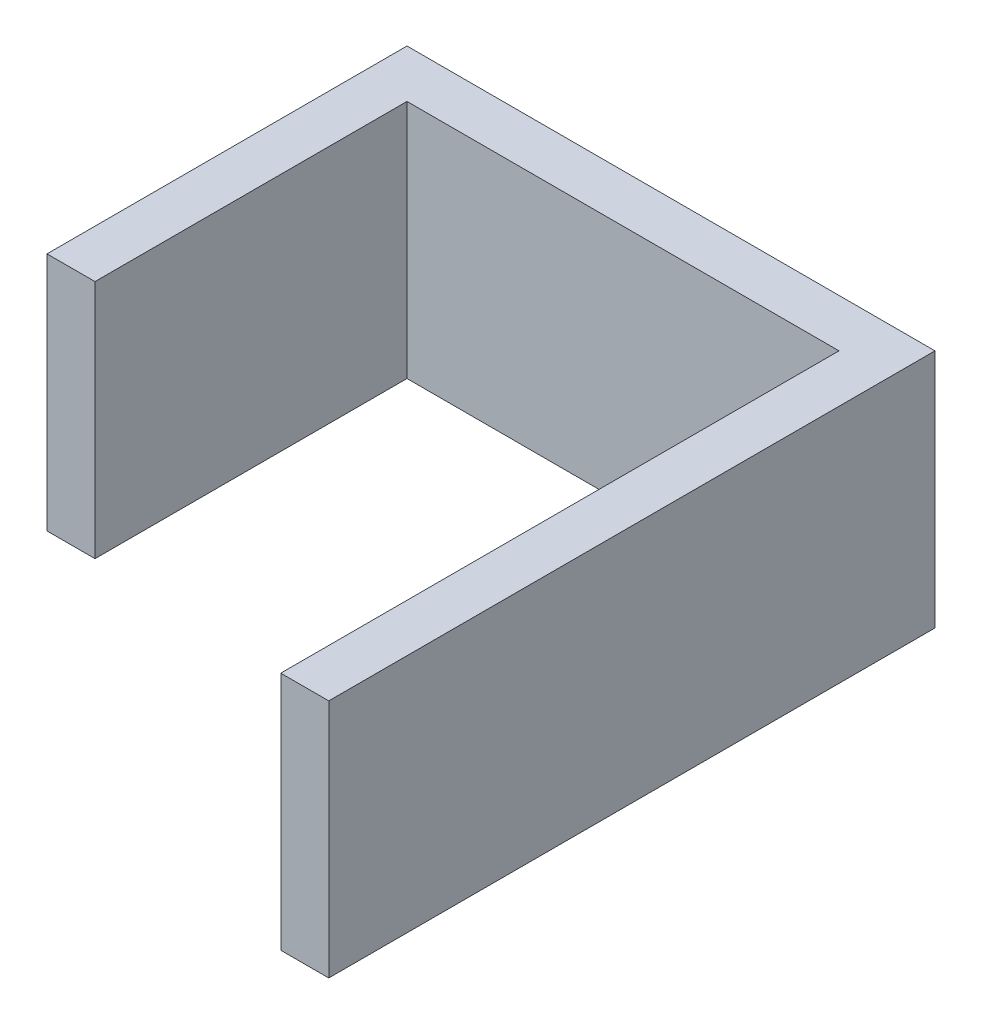
ISO-10303-21;
HEADER;
FILE_DESCRIPTION(('STEP AP214'),'2;1');
FILE_NAME('part.step','',(''),(''),'','','');
FILE_SCHEMA(('AUTOMOTIVE_DESIGN { 1 0 10303 214 1 1 1 1 }'));
ENDSEC;
DATA;
#1=APPLICATION_CONTEXT('core data for automotive mechanical design processes');
#2=APPLICATION_PROTOCOL_DEFINITION('international standard','automotive_design',2000,#1);
#3=PRODUCT_CONTEXT('',#1,'mechanical');
#4=PRODUCT('Part','Part','',(#3));
#5=PRODUCT_RELATED_PRODUCT_CATEGORY('part','',(#4));
#6=PRODUCT_DEFINITION_FORMATION('','',#4);
#7=PRODUCT_DEFINITION_CONTEXT('part definition',#1,'design');
#8=PRODUCT_DEFINITION('design','',#6,#7);
#9=PRODUCT_DEFINITION_SHAPE('','',#8);
#10=(LENGTH_UNIT() NAMED_UNIT(*) SI_UNIT(.MILLI.,.METRE.));
#11=(NAMED_UNIT(*) PLANE_ANGLE_UNIT() SI_UNIT($,.RADIAN.));
#12=(NAMED_UNIT(*) SI_UNIT($,.STERADIAN.) SOLID_ANGLE_UNIT());
#13=UNCERTAINTY_MEASURE_WITH_UNIT(LENGTH_MEASURE(1.E-05),#10,'distance_accuracy_value','');
#14=(GEOMETRIC_REPRESENTATION_CONTEXT(3) GLOBAL_UNCERTAINTY_ASSIGNED_CONTEXT((#13)) GLOBAL_UNIT_ASSIGNED_CONTEXT((#10,
#11,#12)) REPRESENTATION_CONTEXT('',''));
#15=CARTESIAN_POINT('',(0.,0.,0.));
#16=DIRECTION('',(0.,0.,1.));
#17=DIRECTION('',(1.,0.,0.));
#18=AXIS2_PLACEMENT_3D('',#15,#16,#17);
#19=CARTESIAN_POINT('',(-10.,10.,7.5));
#20=DIRECTION('',(1.,0.,0.));
#21=DIRECTION('',(0.,0.,-1.));
#22=AXIS2_PLACEMENT_3D('',#19,#20,#21);
#23=PLANE('',#22);
#24=DIRECTION('',(0.,0.,1.));
#25=VECTOR('',#24,1.);
#26=CARTESIAN_POINT('',(-10.,0.,7.5));
#27=LINE('',#26,#25);
#28=CARTESIAN_POINT('',(-10.,0.,-7.5));
#29=VERTEX_POINT('',#28);
#30=CARTESIAN_POINT('',(-10.,0.,7.5));
#31=VERTEX_POINT('',#30);
#32=EDGE_CURVE('E130',#29,#31,#27,.T.);
#33=ORIENTED_EDGE('',*,*,#32,.T.);
#34=DIRECTION('',(0.,-1.,0.));
#35=VECTOR('',#34,1.);
#36=CARTESIAN_POINT('',(-10.,10.,7.5));
#37=LINE('',#36,#35);
#38=CARTESIAN_POINT('',(-10.,10.,7.5));
#39=VERTEX_POINT('',#38);
#40=EDGE_CURVE('E11',#39,#31,#37,.T.);
#41=ORIENTED_EDGE('',*,*,#40,.F.);
#42=DIRECTION('',(0.,0.,1.));
#43=VECTOR('',#42,1.);
#44=CARTESIAN_POINT('',(-10.,10.,7.5));
#45=LINE('',#44,#43);
#46=CARTESIAN_POINT('',(-10.,10.,-7.5));
#47=VERTEX_POINT('',#46);
#48=EDGE_CURVE('E145',#47,#39,#45,.T.);
#49=ORIENTED_EDGE('',*,*,#48,.F.);
#50=DIRECTION('',(0.,-1.,0.));
#51=VECTOR('',#50,1.);
#52=CARTESIAN_POINT('',(-10.,10.,-7.5));
#53=LINE('',#52,#51);
#54=EDGE_CURVE('E126',#47,#29,#53,.T.);
#55=ORIENTED_EDGE('',*,*,#54,.T.);
#56=EDGE_LOOP('',(#33,#41,#49,#55));
#57=FACE_BOUND('',#56,.T.);
#58=ADVANCED_FACE('F33',(#57),#23,.F.);
#59=CARTESIAN_POINT('',(-10.,10.,7.5));
#60=DIRECTION('',(0.,0.,-1.));
#61=DIRECTION('',(-1.,0.,0.));
#62=AXIS2_PLACEMENT_3D('',#59,#60,#61);
#63=PLANE('',#62);
#64=DIRECTION('',(1.,0.,0.));
#65=VECTOR('',#64,1.);
#66=CARTESIAN_POINT('',(-10.,0.,7.5));
#67=LINE('',#66,#65);
#68=CARTESIAN_POINT('',(-8.,0.,7.5));
#69=VERTEX_POINT('',#68);
#70=EDGE_CURVE('E133',#31,#69,#67,.T.);
#71=ORIENTED_EDGE('',*,*,#70,.T.);
#72=DIRECTION('',(0.,-1.,0.));
#73=VECTOR('',#72,1.);
#74=CARTESIAN_POINT('',(-8.,10.,7.5));
#75=LINE('',#74,#73);
#76=CARTESIAN_POINT('',(-8.,10.,7.5));
#77=VERTEX_POINT('',#76);
#78=EDGE_CURVE('E41',#77,#69,#75,.T.);
#79=ORIENTED_EDGE('',*,*,#78,.F.);
#80=DIRECTION('',(1.,0.,0.));
#81=VECTOR('',#80,1.);
#82=CARTESIAN_POINT('',(-10.,10.,7.5));
#83=LINE('',#82,#81);
#84=EDGE_CURVE('E90',#39,#77,#83,.T.);
#85=ORIENTED_EDGE('',*,*,#84,.F.);
#86=ORIENTED_EDGE('',*,*,#40,.T.);
#87=EDGE_LOOP('',(#71,#79,#85,#86));
#88=FACE_BOUND('',#87,.T.);
#89=ADVANCED_FACE('F178',(#88),#63,.F.);
#90=CARTESIAN_POINT('',(-8.,10.,-5.5));
#91=DIRECTION('',(-1.,0.,0.));
#92=DIRECTION('',(0.,0.,1.));
#93=AXIS2_PLACEMENT_3D('',#90,#91,#92);
#94=PLANE('',#93);
#95=DIRECTION('',(0.,0.,-1.));
#96=VECTOR('',#95,1.);
#97=CARTESIAN_POINT('',(-8.,0.,-5.5));
#98=LINE('',#97,#96);
#99=CARTESIAN_POINT('',(-8.,0.,-5.5));
#100=VERTEX_POINT('',#99);
#101=EDGE_CURVE('E135',#69,#100,#98,.T.);
#102=ORIENTED_EDGE('',*,*,#101,.T.);
#103=DIRECTION('',(0.,-1.,0.));
#104=VECTOR('',#103,1.);
#105=CARTESIAN_POINT('',(-8.,10.,-5.5));
#106=LINE('',#105,#104);
#107=CARTESIAN_POINT('',(-8.,10.,-5.5));
#108=VERTEX_POINT('',#107);
#109=EDGE_CURVE('E152',#108,#100,#106,.T.);
#110=ORIENTED_EDGE('',*,*,#109,.F.);
#111=DIRECTION('',(0.,0.,-1.));
#112=VECTOR('',#111,1.);
#113=CARTESIAN_POINT('',(-8.,10.,-5.5));
#114=LINE('',#113,#112);
#115=EDGE_CURVE('E160',#77,#108,#114,.T.);
#116=ORIENTED_EDGE('',*,*,#115,.F.);
#117=ORIENTED_EDGE('',*,*,#78,.T.);
#118=EDGE_LOOP('',(#102,#110,#116,#117));
#119=FACE_BOUND('',#118,.T.);
#120=ADVANCED_FACE('F158',(#119),#94,.F.);
#121=CARTESIAN_POINT('',(-8.,10.,-5.5));
#122=DIRECTION('',(0.,0.,-1.));
#123=DIRECTION('',(-1.,0.,0.));
#124=AXIS2_PLACEMENT_3D('',#121,#122,#123);
#125=PLANE('',#124);
#126=DIRECTION('',(1.,0.,0.));
#127=VECTOR('',#126,1.);
#128=CARTESIAN_POINT('',(-8.,0.,-5.5));
#129=LINE('',#128,#127);
#130=CARTESIAN_POINT('',(10.,0.,-5.5));
#131=VERTEX_POINT('',#130);
#132=EDGE_CURVE('E137',#100,#131,#129,.T.);
#133=ORIENTED_EDGE('',*,*,#132,.T.);
#134=DIRECTION('',(0.,-1.,0.));
#135=VECTOR('',#134,1.);
#136=CARTESIAN_POINT('',(10.,10.,-5.5));
#137=LINE('',#136,#135);
#138=CARTESIAN_POINT('',(10.,10.,-5.5));
#139=VERTEX_POINT('',#138);
#140=EDGE_CURVE('E149',#139,#131,#137,.T.);
#141=ORIENTED_EDGE('',*,*,#140,.F.);
#142=DIRECTION('',(1.,0.,0.));
#143=VECTOR('',#142,1.);
#144=CARTESIAN_POINT('',(-8.,10.,-5.5));
#145=LINE('',#144,#143);
#146=EDGE_CURVE('E170',#108,#139,#145,.T.);
#147=ORIENTED_EDGE('',*,*,#146,.F.);
#148=ORIENTED_EDGE('',*,*,#109,.T.);
#149=EDGE_LOOP('',(#133,#141,#147,#148));
#150=FACE_BOUND('',#149,.T.);
#151=ADVANCED_FACE('F166',(#150),#125,.F.);
#152=CARTESIAN_POINT('',(10.,10.,-5.5));
#153=DIRECTION('',(1.,0.,0.));
#154=DIRECTION('',(0.,0.,-1.));
#155=AXIS2_PLACEMENT_3D('',#152,#153,#154);
#156=PLANE('',#155);
#157=DIRECTION('',(0.,0.,1.));
#158=VECTOR('',#157,1.);
#159=CARTESIAN_POINT('',(10.,0.,-5.5));
#160=LINE('',#159,#158);
#161=CARTESIAN_POINT('',(10.,0.,17.7602230483271));
#162=VERTEX_POINT('',#161);
#163=EDGE_CURVE('E139',#131,#162,#160,.T.);
#164=ORIENTED_EDGE('',*,*,#163,.T.);
#165=DIRECTION('',(0.,-1.,0.));
#166=VECTOR('',#165,1.);
#167=CARTESIAN_POINT('',(10.,10.,17.7602230483271));
#168=LINE('',#167,#166);
#169=CARTESIAN_POINT('',(10.,10.,17.7602230483271));
#170=VERTEX_POINT('',#169);
#171=EDGE_CURVE('E121',#170,#162,#168,.T.);
#172=ORIENTED_EDGE('',*,*,#171,.F.);
#173=DIRECTION('',(0.,0.,1.));
#174=VECTOR('',#173,1.);
#175=CARTESIAN_POINT('',(10.,10.,-5.5));
#176=LINE('',#175,#174);
#177=EDGE_CURVE('E110',#139,#170,#176,.T.);
#178=ORIENTED_EDGE('',*,*,#177,.F.);
#179=ORIENTED_EDGE('',*,*,#140,.T.);
#180=EDGE_LOOP('',(#164,#172,#178,#179));
#181=FACE_BOUND('',#180,.T.);
#182=ADVANCED_FACE('F169',(#181),#156,.F.);
#183=CARTESIAN_POINT('',(10.,10.,17.7602230483271));
#184=DIRECTION('',(0.,0.,-1.));
#185=DIRECTION('',(-1.,0.,0.));
#186=AXIS2_PLACEMENT_3D('',#183,#184,#185);
#187=PLANE('',#186);
#188=DIRECTION('',(1.,0.,0.));
#189=VECTOR('',#188,1.);
#190=CARTESIAN_POINT('',(10.,0.,17.7602230483271));
#191=LINE('',#190,#189);
#192=CARTESIAN_POINT('',(12.,0.,17.7602230483271));
#193=VERTEX_POINT('',#192);
#194=EDGE_CURVE('E119',#162,#193,#191,.T.);
#195=ORIENTED_EDGE('',*,*,#194,.T.);
#196=DIRECTION('',(0.,-1.,0.));
#197=VECTOR('',#196,1.);
#198=CARTESIAN_POINT('',(12.,10.,17.7602230483271));
#199=LINE('',#198,#197);
#200=CARTESIAN_POINT('',(12.,10.,17.7602230483271));
#201=VERTEX_POINT('',#200);
#202=EDGE_CURVE('E116',#201,#193,#199,.T.);
#203=ORIENTED_EDGE('',*,*,#202,.F.);
#204=DIRECTION('',(1.,0.,0.));
#205=VECTOR('',#204,1.);
#206=CARTESIAN_POINT('',(10.,10.,17.7602230483271));
#207=LINE('',#206,#205);
#208=EDGE_CURVE('E103',#170,#201,#207,.T.);
#209=ORIENTED_EDGE('',*,*,#208,.F.);
#210=ORIENTED_EDGE('',*,*,#171,.T.);
#211=EDGE_LOOP('',(#195,#203,#209,#210));
#212=FACE_BOUND('',#211,.T.);
#213=ADVANCED_FACE('F117',(#212),#187,.F.);
#214=CARTESIAN_POINT('',(12.,10.,17.7602230483271));
#215=DIRECTION('',(-1.,0.,0.));
#216=DIRECTION('',(0.,0.,1.));
#217=AXIS2_PLACEMENT_3D('',#214,#215,#216);
#218=PLANE('',#217);
#219=DIRECTION('',(0.,0.,-1.));
#220=VECTOR('',#219,1.);
#221=CARTESIAN_POINT('',(12.,0.,17.7602230483271));
#222=LINE('',#221,#220);
#223=CARTESIAN_POINT('',(12.,0.,-7.5));
#224=VERTEX_POINT('',#223);
#225=EDGE_CURVE('E142',#193,#224,#222,.T.);
#226=ORIENTED_EDGE('',*,*,#225,.T.);
#227=DIRECTION('',(0.,-1.,0.));
#228=VECTOR('',#227,1.);
#229=CARTESIAN_POINT('',(12.,10.,-7.5));
#230=LINE('',#229,#228);
#231=CARTESIAN_POINT('',(12.,10.,-7.5));
#232=VERTEX_POINT('',#231);
#233=EDGE_CURVE('E122',#232,#224,#230,.T.);
#234=ORIENTED_EDGE('',*,*,#233,.F.);
#235=DIRECTION('',(0.,0.,-1.));
#236=VECTOR('',#235,1.);
#237=CARTESIAN_POINT('',(12.,10.,17.7602230483271));
#238=LINE('',#237,#236);
#239=EDGE_CURVE('E107',#201,#232,#238,.T.);
#240=ORIENTED_EDGE('',*,*,#239,.F.);
#241=ORIENTED_EDGE('',*,*,#202,.T.);
#242=EDGE_LOOP('',(#226,#234,#240,#241));
#243=FACE_BOUND('',#242,.T.);
#244=ADVANCED_FACE('F124',(#243),#218,.F.);
#245=CARTESIAN_POINT('',(10.,10.,-7.5));
#246=DIRECTION('',(0.,0.,1.));
#247=DIRECTION('',(1.,0.,0.));
#248=AXIS2_PLACEMENT_3D('',#245,#246,#247);
#249=PLANE('',#248);
#250=DIRECTION('',(-1.,0.,0.));
#251=VECTOR('',#250,1.);
#252=CARTESIAN_POINT('',(10.,0.,-7.5));
#253=LINE('',#252,#251);
#254=EDGE_CURVE('E78',#224,#29,#253,.T.);
#255=ORIENTED_EDGE('',*,*,#254,.T.);
#256=ORIENTED_EDGE('',*,*,#54,.F.);
#257=DIRECTION('',(-1.,0.,0.));
#258=VECTOR('',#257,1.);
#259=CARTESIAN_POINT('',(10.,10.,-7.5));
#260=LINE('',#259,#258);
#261=EDGE_CURVE('E49',#232,#47,#260,.T.);
#262=ORIENTED_EDGE('',*,*,#261,.F.);
#263=ORIENTED_EDGE('',*,*,#233,.T.);
#264=EDGE_LOOP('',(#255,#256,#262,#263));
#265=FACE_BOUND('',#264,.T.);
#266=ADVANCED_FACE('F194',(#265),#249,.F.);
#267=CARTESIAN_POINT('',(0.,10.,0.));
#268=DIRECTION('',(0.,1.,0.));
#269=DIRECTION('',(0.,0.,1.));
#270=AXIS2_PLACEMENT_3D('',#267,#268,#269);
#271=PLANE('',#270);
#272=ORIENTED_EDGE('',*,*,#48,.T.);
#273=ORIENTED_EDGE('',*,*,#84,.T.);
#274=ORIENTED_EDGE('',*,*,#115,.T.);
#275=ORIENTED_EDGE('',*,*,#146,.T.);
#276=ORIENTED_EDGE('',*,*,#177,.T.);
#277=ORIENTED_EDGE('',*,*,#208,.T.);
#278=ORIENTED_EDGE('',*,*,#239,.T.);
#279=ORIENTED_EDGE('',*,*,#261,.T.);
#280=EDGE_LOOP('',(#272,#273,#274,#275,#276,#277,#278,#279));
#281=FACE_BOUND('',#280,.T.);
#282=ADVANCED_FACE('F105',(#281),#271,.T.);
#283=CARTESIAN_POINT('',(0.,0.,0.));
#284=DIRECTION('',(0.,1.,0.));
#285=DIRECTION('',(0.,0.,1.));
#286=AXIS2_PLACEMENT_3D('',#283,#284,#285);
#287=PLANE('',#286);
#288=ORIENTED_EDGE('',*,*,#32,.F.);
#289=ORIENTED_EDGE('',*,*,#254,.F.);
#290=ORIENTED_EDGE('',*,*,#225,.F.);
#291=ORIENTED_EDGE('',*,*,#194,.F.);
#292=ORIENTED_EDGE('',*,*,#163,.F.);
#293=ORIENTED_EDGE('',*,*,#132,.F.);
#294=ORIENTED_EDGE('',*,*,#101,.F.);
#295=ORIENTED_EDGE('',*,*,#70,.F.);
#296=EDGE_LOOP('',(#288,#289,#290,#291,#292,#293,#294,#295));
#297=FACE_BOUND('',#296,.T.);
#298=ADVANCED_FACE('F162',(#297),#287,.F.);
#299=CLOSED_SHELL('',(#58,#89,#120,#151,#182,#213,#244,#266,#282,#298));
#300=MANIFOLD_SOLID_BREP('B2',#299);
#301=ADVANCED_BREP_SHAPE_REPRESENTATION('',(#18,#300),#14);
#302=SHAPE_DEFINITION_REPRESENTATION(#9,#301);
ENDSEC;
END-ISO-10303-21;
